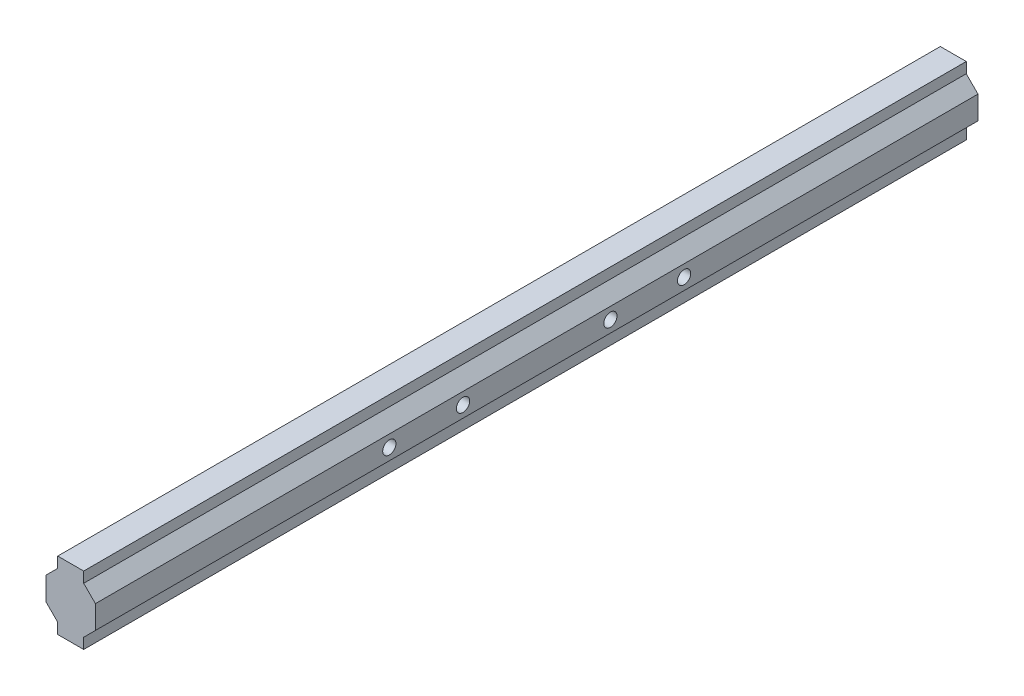
ISO-10303-21;
HEADER;
FILE_DESCRIPTION(('STEP AP214'),'2;1');
FILE_NAME('part.step','',(''),(''),'','','');
FILE_SCHEMA(('AUTOMOTIVE_DESIGN { 1 0 10303 214 1 1 1 1 }'));
ENDSEC;
DATA;
#1=APPLICATION_CONTEXT('core data for automotive mechanical design processes');
#2=APPLICATION_PROTOCOL_DEFINITION('international standard','automotive_design',2000,#1);
#3=PRODUCT_CONTEXT('',#1,'mechanical');
#4=PRODUCT('Part','Part','',(#3));
#5=PRODUCT_RELATED_PRODUCT_CATEGORY('part','',(#4));
#6=PRODUCT_DEFINITION_FORMATION('','',#4);
#7=PRODUCT_DEFINITION_CONTEXT('part definition',#1,'design');
#8=PRODUCT_DEFINITION('design','',#6,#7);
#9=PRODUCT_DEFINITION_SHAPE('','',#8);
#10=(LENGTH_UNIT() NAMED_UNIT(*) SI_UNIT(.MILLI.,.METRE.));
#11=(NAMED_UNIT(*) PLANE_ANGLE_UNIT() SI_UNIT($,.RADIAN.));
#12=(NAMED_UNIT(*) SI_UNIT($,.STERADIAN.) SOLID_ANGLE_UNIT());
#13=UNCERTAINTY_MEASURE_WITH_UNIT(LENGTH_MEASURE(1.E-05),#10,'distance_accuracy_value','');
#14=(GEOMETRIC_REPRESENTATION_CONTEXT(3) GLOBAL_UNCERTAINTY_ASSIGNED_CONTEXT((#13)) GLOBAL_UNIT_ASSIGNED_CONTEXT((#10,
#11,#12)) REPRESENTATION_CONTEXT('',''));
#15=CARTESIAN_POINT('',(0.,0.,0.));
#16=DIRECTION('',(0.,0.,1.));
#17=DIRECTION('',(1.,0.,0.));
#18=AXIS2_PLACEMENT_3D('',#15,#16,#17);
#19=CARTESIAN_POINT('',(-39.550290087148,0.0297695452971111,316.106580091162));
#20=DIRECTION('',(1.,0.,0.));
#21=DIRECTION('',(0.,0.,-1.));
#22=AXIS2_PLACEMENT_3D('',#19,#20,#21);
#23=PLANE('',#22);
#24=CARTESIAN_POINT('',(-39.550290087148,2.66200259233075,182.706580091162));
#25=DIRECTION('',(1.,0.,0.));
#26=DIRECTION('',(0.,0.,-1.));
#27=AXIS2_PLACEMENT_3D('',#24,#25,#26);
#28=CIRCLE('',#27,1.50000000000003);
#29=CARTESIAN_POINT('',(-39.550290087148,2.66200259233075,181.206580091161));
#30=VERTEX_POINT('',#29);
#31=EDGE_CURVE('E172',#30,#30,#28,.T.);
#32=ORIENTED_EDGE('',*,*,#31,.T.);
#33=EDGE_LOOP('',(#32));
#34=FACE_BOUND('',#33,.T.);
#35=CARTESIAN_POINT('',(-39.550290087148,2.66200259233075,199.406580091162));
#36=DIRECTION('',(1.,0.,0.));
#37=DIRECTION('',(0.,0.,-1.));
#38=AXIS2_PLACEMENT_3D('',#35,#36,#37);
#39=CIRCLE('',#38,1.50000000000003);
#40=CARTESIAN_POINT('',(-39.550290087148,2.66200259233075,197.906580091161));
#41=VERTEX_POINT('',#40);
#42=EDGE_CURVE('E280',#41,#41,#39,.T.);
#43=ORIENTED_EDGE('',*,*,#42,.T.);
#44=EDGE_LOOP('',(#43));
#45=FACE_BOUND('',#44,.T.);
#46=CARTESIAN_POINT('',(-39.550290087148,2.66200259233074,249.506580091162));
#47=DIRECTION('',(1.,0.,0.));
#48=DIRECTION('',(0.,0.,-1.));
#49=AXIS2_PLACEMENT_3D('',#46,#47,#48);
#50=CIRCLE('',#49,1.50000000000003);
#51=CARTESIAN_POINT('',(-39.550290087148,2.66200259233074,248.006580091161));
#52=VERTEX_POINT('',#51);
#53=EDGE_CURVE('E284',#52,#52,#50,.T.);
#54=ORIENTED_EDGE('',*,*,#53,.T.);
#55=EDGE_LOOP('',(#54));
#56=FACE_BOUND('',#55,.T.);
#57=CARTESIAN_POINT('',(-39.550290087148,2.66200259233074,232.806580091162));
#58=DIRECTION('',(1.,0.,0.));
#59=DIRECTION('',(0.,0.,-1.));
#60=AXIS2_PLACEMENT_3D('',#57,#58,#59);
#61=CIRCLE('',#60,1.50000000000003);
#62=CARTESIAN_POINT('',(-39.550290087148,2.66200259233074,231.306580091161));
#63=VERTEX_POINT('',#62);
#64=EDGE_CURVE('E287',#63,#63,#61,.T.);
#65=ORIENTED_EDGE('',*,*,#64,.T.);
#66=EDGE_LOOP('',(#65));
#67=FACE_BOUND('',#66,.T.);
#68=DIRECTION('',(0.,-1.,0.));
#69=VECTOR('',#68,1.);
#70=CARTESIAN_POINT('',(-39.550290087148,0.0297695452971111,116.106580091162));
#71=LINE('',#70,#69);
#72=CARTESIAN_POINT('',(-39.550290087148,5.29423563936438,116.106580091162));
#73=VERTEX_POINT('',#72);
#74=CARTESIAN_POINT('',(-39.550290087148,0.0297695452971111,116.106580091162));
#75=VERTEX_POINT('',#74);
#76=EDGE_CURVE('E168',#73,#75,#71,.T.);
#77=ORIENTED_EDGE('',*,*,#76,.T.);
#78=DIRECTION('',(0.,0.,-1.));
#79=VECTOR('',#78,1.);
#80=CARTESIAN_POINT('',(-39.550290087148,0.0297695452971111,316.106580091162));
#81=LINE('',#80,#79);
#82=CARTESIAN_POINT('',(-39.550290087148,0.0297695452971111,316.106580091162));
#83=VERTEX_POINT('',#82);
#84=EDGE_CURVE('E13',#83,#75,#81,.T.);
#85=ORIENTED_EDGE('',*,*,#84,.F.);
#86=DIRECTION('',(0.,-1.,0.));
#87=VECTOR('',#86,1.);
#88=CARTESIAN_POINT('',(-39.550290087148,0.0297695452971111,316.106580091162));
#89=LINE('',#88,#87);
#90=CARTESIAN_POINT('',(-39.550290087148,5.29423563936438,316.106580091162));
#91=VERTEX_POINT('',#90);
#92=EDGE_CURVE('E191',#91,#83,#89,.T.);
#93=ORIENTED_EDGE('',*,*,#92,.F.);
#94=DIRECTION('',(0.,0.,-1.));
#95=VECTOR('',#94,1.);
#96=CARTESIAN_POINT('',(-39.550290087148,5.29423563936438,316.106580091162));
#97=LINE('',#96,#95);
#98=EDGE_CURVE('E164',#91,#73,#97,.T.);
#99=ORIENTED_EDGE('',*,*,#98,.T.);
#100=EDGE_LOOP('',(#77,#85,#93,#99));
#101=FACE_BOUND('',#100,.T.);
#102=ADVANCED_FACE('F48',(#34,#45,#56,#67,#101),#23,.F.);
#103=CARTESIAN_POINT('',(-36.8896299153682,-2.63089062648271,316.106580091162));
#104=DIRECTION('',(0.707106781186547,0.707106781186547,0.));
#105=DIRECTION('',(-0.707106781186548,0.707106781186548,0.));
#106=AXIS2_PLACEMENT_3D('',#103,#104,#105);
#107=PLANE('',#106);
#108=DIRECTION('',(0.707106781186547,-0.707106781186547,0.));
#109=VECTOR('',#108,1.);
#110=CARTESIAN_POINT('',(-36.8896299153682,-2.63089062648271,116.106580091162));
#111=LINE('',#110,#109);
#112=CARTESIAN_POINT('',(-36.8896299153682,-2.63089062648271,116.106580091162));
#113=VERTEX_POINT('',#112);
#114=EDGE_CURVE('E171',#75,#113,#111,.T.);
#115=ORIENTED_EDGE('',*,*,#114,.T.);
#116=DIRECTION('',(0.,0.,-1.));
#117=VECTOR('',#116,1.);
#118=CARTESIAN_POINT('',(-36.8896299153682,-2.63089062648271,316.106580091162));
#119=LINE('',#118,#117);
#120=CARTESIAN_POINT('',(-36.8896299153682,-2.63089062648271,316.106580091162));
#121=VERTEX_POINT('',#120);
#122=EDGE_CURVE('E56',#121,#113,#119,.T.);
#123=ORIENTED_EDGE('',*,*,#122,.F.);
#124=DIRECTION('',(0.707106781186547,-0.707106781186547,0.));
#125=VECTOR('',#124,1.);
#126=CARTESIAN_POINT('',(-36.8896299153682,-2.63089062648271,316.106580091162));
#127=LINE('',#126,#125);
#128=EDGE_CURVE('E119',#83,#121,#127,.T.);
#129=ORIENTED_EDGE('',*,*,#128,.F.);
#130=ORIENTED_EDGE('',*,*,#84,.T.);
#131=EDGE_LOOP('',(#115,#123,#129,#130));
#132=FACE_BOUND('',#131,.T.);
#133=ADVANCED_FACE('F269',(#132),#107,.F.);
#134=CARTESIAN_POINT('',(-36.8896299153682,-5.03799740766926,316.106580091162));
#135=DIRECTION('',(1.,0.,0.));
#136=DIRECTION('',(0.,0.,-1.));
#137=AXIS2_PLACEMENT_3D('',#134,#135,#136);
#138=PLANE('',#137);
#139=DIRECTION('',(0.,-1.,0.));
#140=VECTOR('',#139,1.);
#141=CARTESIAN_POINT('',(-36.8896299153682,-5.03799740766926,116.106580091162));
#142=LINE('',#141,#140);
#143=CARTESIAN_POINT('',(-36.8896299153682,-5.03799740766926,116.106580091162));
#144=VERTEX_POINT('',#143);
#145=EDGE_CURVE('E174',#113,#144,#142,.T.);
#146=ORIENTED_EDGE('',*,*,#145,.T.);
#147=DIRECTION('',(0.,0.,-1.));
#148=VECTOR('',#147,1.);
#149=CARTESIAN_POINT('',(-36.8896299153682,-5.03799740766926,316.106580091162));
#150=LINE('',#149,#148);
#151=CARTESIAN_POINT('',(-36.8896299153682,-5.03799740766926,316.106580091162));
#152=VERTEX_POINT('',#151);
#153=EDGE_CURVE('E210',#152,#144,#150,.T.);
#154=ORIENTED_EDGE('',*,*,#153,.F.);
#155=DIRECTION('',(0.,-1.,0.));
#156=VECTOR('',#155,1.);
#157=CARTESIAN_POINT('',(-36.8896299153682,-5.03799740766926,316.106580091162));
#158=LINE('',#157,#156);
#159=EDGE_CURVE('E218',#121,#152,#158,.T.);
#160=ORIENTED_EDGE('',*,*,#159,.F.);
#161=ORIENTED_EDGE('',*,*,#122,.T.);
#162=EDGE_LOOP('',(#146,#154,#160,#161));
#163=FACE_BOUND('',#162,.T.);
#164=ADVANCED_FACE('F216',(#163),#138,.F.);
#165=CARTESIAN_POINT('',(-31.0109502589278,-5.03799740766925,316.106580091162));
#166=DIRECTION('',(0.,1.,0.));
#167=DIRECTION('',(-1.,0.,0.));
#168=AXIS2_PLACEMENT_3D('',#165,#166,#167);
#169=PLANE('',#168);
#170=DIRECTION('',(1.,0.,0.));
#171=VECTOR('',#170,1.);
#172=CARTESIAN_POINT('',(-31.0109502589278,-5.03799740766925,116.106580091162));
#173=LINE('',#172,#171);
#174=CARTESIAN_POINT('',(-31.0109502589278,-5.03799740766925,116.106580091162));
#175=VERTEX_POINT('',#174);
#176=EDGE_CURVE('E176',#144,#175,#173,.T.);
#177=ORIENTED_EDGE('',*,*,#176,.T.);
#178=DIRECTION('',(0.,0.,-1.));
#179=VECTOR('',#178,1.);
#180=CARTESIAN_POINT('',(-31.0109502589278,-5.03799740766925,316.106580091162));
#181=LINE('',#180,#179);
#182=CARTESIAN_POINT('',(-31.0109502589278,-5.03799740766925,316.106580091162));
#183=VERTEX_POINT('',#182);
#184=EDGE_CURVE('E207',#183,#175,#181,.T.);
#185=ORIENTED_EDGE('',*,*,#184,.F.);
#186=DIRECTION('',(1.,0.,0.));
#187=VECTOR('',#186,1.);
#188=CARTESIAN_POINT('',(-31.0109502589278,-5.03799740766925,316.106580091162));
#189=LINE('',#188,#187);
#190=EDGE_CURVE('E236',#152,#183,#189,.T.);
#191=ORIENTED_EDGE('',*,*,#190,.F.);
#192=ORIENTED_EDGE('',*,*,#153,.T.);
#193=EDGE_LOOP('',(#177,#185,#191,#192));
#194=FACE_BOUND('',#193,.T.);
#195=ADVANCED_FACE('F227',(#194),#169,.F.);
#196=CARTESIAN_POINT('',(-31.0109502589278,-2.63089062648273,316.106580091162));
#197=DIRECTION('',(-1.,0.,0.));
#198=DIRECTION('',(0.,0.,1.));
#199=AXIS2_PLACEMENT_3D('',#196,#197,#198);
#200=PLANE('',#199);
#201=DIRECTION('',(0.,1.,0.));
#202=VECTOR('',#201,1.);
#203=CARTESIAN_POINT('',(-31.0109502589278,-2.63089062648273,116.106580091162));
#204=LINE('',#203,#202);
#205=CARTESIAN_POINT('',(-31.0109502589278,-2.63089062648273,116.106580091162));
#206=VERTEX_POINT('',#205);
#207=EDGE_CURVE('E178',#175,#206,#204,.T.);
#208=ORIENTED_EDGE('',*,*,#207,.T.);
#209=DIRECTION('',(0.,0.,-1.));
#210=VECTOR('',#209,1.);
#211=CARTESIAN_POINT('',(-31.0109502589278,-2.63089062648273,316.106580091162));
#212=LINE('',#211,#210);
#213=CARTESIAN_POINT('',(-31.0109502589278,-2.63089062648273,316.106580091162));
#214=VERTEX_POINT('',#213);
#215=EDGE_CURVE('E204',#214,#206,#212,.T.);
#216=ORIENTED_EDGE('',*,*,#215,.F.);
#217=DIRECTION('',(0.,1.,0.));
#218=VECTOR('',#217,1.);
#219=CARTESIAN_POINT('',(-31.0109502589278,-2.63089062648273,316.106580091162));
#220=LINE('',#219,#218);
#221=EDGE_CURVE('E233',#183,#214,#220,.T.);
#222=ORIENTED_EDGE('',*,*,#221,.F.);
#223=ORIENTED_EDGE('',*,*,#184,.T.);
#224=EDGE_LOOP('',(#208,#216,#222,#223));
#225=FACE_BOUND('',#224,.T.);
#226=ADVANCED_FACE('F231',(#225),#200,.F.);
#227=CARTESIAN_POINT('',(-28.350290087148,0.0297695452971137,316.106580091162));
#228=DIRECTION('',(-0.707106781186548,0.707106781186548,0.));
#229=DIRECTION('',(-0.707106781186548,-0.707106781186548,0.));
#230=AXIS2_PLACEMENT_3D('',#227,#228,#229);
#231=PLANE('',#230);
#232=DIRECTION('',(0.707106781186548,0.707106781186548,0.));
#233=VECTOR('',#232,1.);
#234=CARTESIAN_POINT('',(-28.350290087148,0.0297695452971137,116.106580091162));
#235=LINE('',#234,#233);
#236=CARTESIAN_POINT('',(-28.350290087148,0.0297695452971137,116.106580091162));
#237=VERTEX_POINT('',#236);
#238=EDGE_CURVE('E180',#206,#237,#235,.T.);
#239=ORIENTED_EDGE('',*,*,#238,.T.);
#240=DIRECTION('',(0.,0.,-1.));
#241=VECTOR('',#240,1.);
#242=CARTESIAN_POINT('',(-28.350290087148,0.0297695452971137,316.106580091162));
#243=LINE('',#242,#241);
#244=CARTESIAN_POINT('',(-28.350290087148,0.0297695452971137,316.106580091162));
#245=VERTEX_POINT('',#244);
#246=EDGE_CURVE('E201',#245,#237,#243,.T.);
#247=ORIENTED_EDGE('',*,*,#246,.F.);
#248=DIRECTION('',(0.707106781186548,0.707106781186548,0.));
#249=VECTOR('',#248,1.);
#250=CARTESIAN_POINT('',(-28.350290087148,0.0297695452971137,316.106580091162));
#251=LINE('',#250,#249);
#252=EDGE_CURVE('E235',#214,#245,#251,.T.);
#253=ORIENTED_EDGE('',*,*,#252,.F.);
#254=ORIENTED_EDGE('',*,*,#215,.T.);
#255=EDGE_LOOP('',(#239,#247,#253,#254));
#256=FACE_BOUND('',#255,.T.);
#257=ADVANCED_FACE('F315',(#256),#231,.F.);
#258=CARTESIAN_POINT('',(-28.350290087148,5.29423563936437,316.106580091162));
#259=DIRECTION('',(-1.,0.,0.));
#260=DIRECTION('',(0.,0.,1.));
#261=AXIS2_PLACEMENT_3D('',#258,#259,#260);
#262=PLANE('',#261);
#263=CARTESIAN_POINT('',(-28.350290087148,2.66200259233075,182.706580091162));
#264=DIRECTION('',(1.,0.,0.));
#265=DIRECTION('',(0.,0.,1.));
#266=AXIS2_PLACEMENT_3D('',#263,#264,#265);
#267=CIRCLE('',#266,1.50000000000003);
#268=CARTESIAN_POINT('',(-28.350290087148,2.66200259233075,184.206580091162));
#269=VERTEX_POINT('',#268);
#270=EDGE_CURVE('E300',#269,#269,#267,.T.);
#271=ORIENTED_EDGE('',*,*,#270,.F.);
#272=EDGE_LOOP('',(#271));
#273=FACE_BOUND('',#272,.T.);
#274=CARTESIAN_POINT('',(-28.350290087148,2.66200259233075,199.406580091162));
#275=DIRECTION('',(1.,0.,0.));
#276=DIRECTION('',(0.,0.,1.));
#277=AXIS2_PLACEMENT_3D('',#274,#275,#276);
#278=CIRCLE('',#277,1.50000000000003);
#279=CARTESIAN_POINT('',(-28.350290087148,2.66200259233075,200.906580091162));
#280=VERTEX_POINT('',#279);
#281=EDGE_CURVE('E303',#280,#280,#278,.T.);
#282=ORIENTED_EDGE('',*,*,#281,.F.);
#283=EDGE_LOOP('',(#282));
#284=FACE_BOUND('',#283,.T.);
#285=CARTESIAN_POINT('',(-28.350290087148,2.66200259233074,249.506580091162));
#286=DIRECTION('',(1.,0.,0.));
#287=DIRECTION('',(0.,0.,-1.));
#288=AXIS2_PLACEMENT_3D('',#285,#286,#287);
#289=CIRCLE('',#288,1.50000000000003);
#290=CARTESIAN_POINT('',(-28.350290087148,2.66200259233074,248.006580091161));
#291=VERTEX_POINT('',#290);
#292=EDGE_CURVE('E293',#291,#291,#289,.T.);
#293=ORIENTED_EDGE('',*,*,#292,.F.);
#294=EDGE_LOOP('',(#293));
#295=FACE_BOUND('',#294,.T.);
#296=CARTESIAN_POINT('',(-28.350290087148,2.66200259233074,232.806580091162));
#297=DIRECTION('',(1.,0.,0.));
#298=DIRECTION('',(0.,0.,-1.));
#299=AXIS2_PLACEMENT_3D('',#296,#297,#298);
#300=CIRCLE('',#299,1.50000000000003);
#301=CARTESIAN_POINT('',(-28.350290087148,2.66200259233074,231.306580091161));
#302=VERTEX_POINT('',#301);
#303=EDGE_CURVE('E289',#302,#302,#300,.T.);
#304=ORIENTED_EDGE('',*,*,#303,.F.);
#305=EDGE_LOOP('',(#304));
#306=FACE_BOUND('',#305,.T.);
#307=DIRECTION('',(0.,1.,0.));
#308=VECTOR('',#307,1.);
#309=CARTESIAN_POINT('',(-28.350290087148,5.29423563936437,116.106580091162));
#310=LINE('',#309,#308);
#311=CARTESIAN_POINT('',(-28.350290087148,5.29423563936437,116.106580091162));
#312=VERTEX_POINT('',#311);
#313=EDGE_CURVE('E182',#237,#312,#310,.T.);
#314=ORIENTED_EDGE('',*,*,#313,.T.);
#315=DIRECTION('',(0.,0.,-1.));
#316=VECTOR('',#315,1.);
#317=CARTESIAN_POINT('',(-28.350290087148,5.29423563936437,316.106580091162));
#318=LINE('',#317,#316);
#319=CARTESIAN_POINT('',(-28.350290087148,5.29423563936437,316.106580091162));
#320=VERTEX_POINT('',#319);
#321=EDGE_CURVE('E198',#320,#312,#318,.T.);
#322=ORIENTED_EDGE('',*,*,#321,.F.);
#323=DIRECTION('',(0.,1.,0.));
#324=VECTOR('',#323,1.);
#325=CARTESIAN_POINT('',(-28.350290087148,5.29423563936437,316.106580091162));
#326=LINE('',#325,#324);
#327=EDGE_CURVE('E238',#245,#320,#326,.T.);
#328=ORIENTED_EDGE('',*,*,#327,.F.);
#329=ORIENTED_EDGE('',*,*,#246,.T.);
#330=EDGE_LOOP('',(#314,#322,#328,#329));
#331=FACE_BOUND('',#330,.T.);
#332=ADVANCED_FACE('F312',(#273,#284,#295,#306,#331),#262,.F.);
#333=CARTESIAN_POINT('',(-31.0109502589278,7.95489581114419,316.106580091162));
#334=DIRECTION('',(-0.707106781186547,-0.707106781186547,0.));
#335=DIRECTION('',(0.707106781186548,-0.707106781186548,0.));
#336=AXIS2_PLACEMENT_3D('',#333,#334,#335);
#337=PLANE('',#336);
#338=DIRECTION('',(-0.707106781186547,0.707106781186547,0.));
#339=VECTOR('',#338,1.);
#340=CARTESIAN_POINT('',(-31.0109502589278,7.95489581114419,116.106580091162));
#341=LINE('',#340,#339);
#342=CARTESIAN_POINT('',(-31.0109502589278,7.95489581114419,116.106580091162));
#343=VERTEX_POINT('',#342);
#344=EDGE_CURVE('E184',#312,#343,#341,.T.);
#345=ORIENTED_EDGE('',*,*,#344,.T.);
#346=DIRECTION('',(0.,0.,-1.));
#347=VECTOR('',#346,1.);
#348=CARTESIAN_POINT('',(-31.0109502589278,7.95489581114419,316.106580091162));
#349=LINE('',#348,#347);
#350=CARTESIAN_POINT('',(-31.0109502589278,7.95489581114419,316.106580091162));
#351=VERTEX_POINT('',#350);
#352=EDGE_CURVE('E195',#351,#343,#349,.T.);
#353=ORIENTED_EDGE('',*,*,#352,.F.);
#354=DIRECTION('',(-0.707106781186547,0.707106781186547,0.));
#355=VECTOR('',#354,1.);
#356=CARTESIAN_POINT('',(-31.0109502589278,7.95489581114419,316.106580091162));
#357=LINE('',#356,#355);
#358=EDGE_CURVE('E244',#320,#351,#357,.T.);
#359=ORIENTED_EDGE('',*,*,#358,.F.);
#360=ORIENTED_EDGE('',*,*,#321,.T.);
#361=EDGE_LOOP('',(#345,#353,#359,#360));
#362=FACE_BOUND('',#361,.T.);
#363=ADVANCED_FACE('F250',(#362),#337,.F.);
#364=CARTESIAN_POINT('',(-31.0109502589278,10.3620025923307,316.106580091162));
#365=DIRECTION('',(-1.,0.,0.));
#366=DIRECTION('',(0.,0.,1.));
#367=AXIS2_PLACEMENT_3D('',#364,#365,#366);
#368=PLANE('',#367);
#369=DIRECTION('',(0.,1.,0.));
#370=VECTOR('',#369,1.);
#371=CARTESIAN_POINT('',(-31.0109502589278,10.3620025923307,116.106580091162));
#372=LINE('',#371,#370);
#373=CARTESIAN_POINT('',(-31.0109502589278,10.3620025923307,116.106580091162));
#374=VERTEX_POINT('',#373);
#375=EDGE_CURVE('E186',#343,#374,#372,.T.);
#376=ORIENTED_EDGE('',*,*,#375,.T.);
#377=DIRECTION('',(0.,0.,-1.));
#378=VECTOR('',#377,1.);
#379=CARTESIAN_POINT('',(-31.0109502589278,10.3620025923307,316.106580091162));
#380=LINE('',#379,#378);
#381=CARTESIAN_POINT('',(-31.0109502589278,10.3620025923307,316.106580091162));
#382=VERTEX_POINT('',#381);
#383=EDGE_CURVE('E159',#382,#374,#380,.T.);
#384=ORIENTED_EDGE('',*,*,#383,.F.);
#385=DIRECTION('',(0.,1.,0.));
#386=VECTOR('',#385,1.);
#387=CARTESIAN_POINT('',(-31.0109502589278,10.3620025923307,316.106580091162));
#388=LINE('',#387,#386);
#389=EDGE_CURVE('E150',#351,#382,#388,.T.);
#390=ORIENTED_EDGE('',*,*,#389,.F.);
#391=ORIENTED_EDGE('',*,*,#352,.T.);
#392=EDGE_LOOP('',(#376,#384,#390,#391));
#393=FACE_BOUND('',#392,.T.);
#394=ADVANCED_FACE('F254',(#393),#368,.F.);
#395=CARTESIAN_POINT('',(-36.8896299153682,10.3620025923307,316.106580091162));
#396=DIRECTION('',(0.,-1.,0.));
#397=DIRECTION('',(0.,0.,-1.));
#398=AXIS2_PLACEMENT_3D('',#395,#396,#397);
#399=PLANE('',#398);
#400=DIRECTION('',(-1.,0.,0.));
#401=VECTOR('',#400,1.);
#402=CARTESIAN_POINT('',(-36.8896299153682,10.3620025923307,116.106580091162));
#403=LINE('',#402,#401);
#404=CARTESIAN_POINT('',(-36.8896299153682,10.3620025923307,116.106580091162));
#405=VERTEX_POINT('',#404);
#406=EDGE_CURVE('E158',#374,#405,#403,.T.);
#407=ORIENTED_EDGE('',*,*,#406,.T.);
#408=DIRECTION('',(0.,0.,-1.));
#409=VECTOR('',#408,1.);
#410=CARTESIAN_POINT('',(-36.8896299153682,10.3620025923307,316.106580091162));
#411=LINE('',#410,#409);
#412=CARTESIAN_POINT('',(-36.8896299153682,10.3620025923307,316.106580091162));
#413=VERTEX_POINT('',#412);
#414=EDGE_CURVE('E155',#413,#405,#411,.T.);
#415=ORIENTED_EDGE('',*,*,#414,.F.);
#416=DIRECTION('',(-1.,0.,0.));
#417=VECTOR('',#416,1.);
#418=CARTESIAN_POINT('',(-36.8896299153682,10.3620025923307,316.106580091162));
#419=LINE('',#418,#417);
#420=EDGE_CURVE('E144',#382,#413,#419,.T.);
#421=ORIENTED_EDGE('',*,*,#420,.F.);
#422=ORIENTED_EDGE('',*,*,#383,.T.);
#423=EDGE_LOOP('',(#407,#415,#421,#422));
#424=FACE_BOUND('',#423,.T.);
#425=ADVANCED_FACE('F156',(#424),#399,.F.);
#426=CARTESIAN_POINT('',(-36.8896299153682,7.9548958111442,316.106580091162));
#427=DIRECTION('',(1.,0.,0.));
#428=DIRECTION('',(0.,0.,-1.));
#429=AXIS2_PLACEMENT_3D('',#426,#427,#428);
#430=PLANE('',#429);
#431=DIRECTION('',(0.,-1.,0.));
#432=VECTOR('',#431,1.);
#433=CARTESIAN_POINT('',(-36.8896299153682,7.9548958111442,116.106580091162));
#434=LINE('',#433,#432);
#435=CARTESIAN_POINT('',(-36.8896299153682,7.9548958111442,116.106580091162));
#436=VERTEX_POINT('',#435);
#437=EDGE_CURVE('E105',#405,#436,#434,.T.);
#438=ORIENTED_EDGE('',*,*,#437,.T.);
#439=DIRECTION('',(0.,0.,-1.));
#440=VECTOR('',#439,1.);
#441=CARTESIAN_POINT('',(-36.8896299153682,7.9548958111442,316.106580091162));
#442=LINE('',#441,#440);
#443=CARTESIAN_POINT('',(-36.8896299153682,7.9548958111442,316.106580091162));
#444=VERTEX_POINT('',#443);
#445=EDGE_CURVE('E160',#444,#436,#442,.T.);
#446=ORIENTED_EDGE('',*,*,#445,.F.);
#447=DIRECTION('',(0.,-1.,0.));
#448=VECTOR('',#447,1.);
#449=CARTESIAN_POINT('',(-36.8896299153682,7.9548958111442,316.106580091162));
#450=LINE('',#449,#448);
#451=EDGE_CURVE('E148',#413,#444,#450,.T.);
#452=ORIENTED_EDGE('',*,*,#451,.F.);
#453=ORIENTED_EDGE('',*,*,#414,.T.);
#454=EDGE_LOOP('',(#438,#446,#452,#453));
#455=FACE_BOUND('',#454,.T.);
#456=ADVANCED_FACE('F162',(#455),#430,.F.);
#457=CARTESIAN_POINT('',(-39.550290087148,5.29423563936438,316.106580091162));
#458=DIRECTION('',(0.707106781186547,-0.707106781186547,0.));
#459=DIRECTION('',(0.707106781186548,0.707106781186548,0.));
#460=AXIS2_PLACEMENT_3D('',#457,#458,#459);
#461=PLANE('',#460);
#462=DIRECTION('',(-0.707106781186547,-0.707106781186547,0.));
#463=VECTOR('',#462,1.);
#464=CARTESIAN_POINT('',(-39.550290087148,5.29423563936438,116.106580091162));
#465=LINE('',#464,#463);
#466=EDGE_CURVE('E111',#436,#73,#465,.T.);
#467=ORIENTED_EDGE('',*,*,#466,.T.);
#468=ORIENTED_EDGE('',*,*,#98,.F.);
#469=DIRECTION('',(-0.707106781186547,-0.707106781186547,0.));
#470=VECTOR('',#469,1.);
#471=CARTESIAN_POINT('',(-39.550290087148,5.29423563936438,316.106580091162));
#472=LINE('',#471,#470);
#473=EDGE_CURVE('E64',#444,#91,#472,.T.);
#474=ORIENTED_EDGE('',*,*,#473,.F.);
#475=ORIENTED_EDGE('',*,*,#445,.T.);
#476=EDGE_LOOP('',(#467,#468,#474,#475));
#477=FACE_BOUND('',#476,.T.);
#478=ADVANCED_FACE('F258',(#477),#461,.F.);
#479=CARTESIAN_POINT('',(0.,0.,316.106580091162));
#480=DIRECTION('',(0.,0.,-1.));
#481=DIRECTION('',(-1.,0.,0.));
#482=AXIS2_PLACEMENT_3D('',#479,#480,#481);
#483=PLANE('',#482);
#484=ORIENTED_EDGE('',*,*,#92,.T.);
#485=ORIENTED_EDGE('',*,*,#128,.T.);
#486=ORIENTED_EDGE('',*,*,#159,.T.);
#487=ORIENTED_EDGE('',*,*,#190,.T.);
#488=ORIENTED_EDGE('',*,*,#221,.T.);
#489=ORIENTED_EDGE('',*,*,#252,.T.);
#490=ORIENTED_EDGE('',*,*,#327,.T.);
#491=ORIENTED_EDGE('',*,*,#358,.T.);
#492=ORIENTED_EDGE('',*,*,#389,.T.);
#493=ORIENTED_EDGE('',*,*,#420,.T.);
#494=ORIENTED_EDGE('',*,*,#451,.T.);
#495=ORIENTED_EDGE('',*,*,#473,.T.);
#496=EDGE_LOOP('',(#484,#485,#486,#487,#488,#489,#490,#491,#492,#493,#494,#495));
#497=FACE_BOUND('',#496,.T.);
#498=ADVANCED_FACE('F146',(#497),#483,.F.);
#499=CARTESIAN_POINT('',(0.,0.,116.106580091162));
#500=DIRECTION('',(0.,0.,-1.));
#501=DIRECTION('',(-1.,0.,0.));
#502=AXIS2_PLACEMENT_3D('',#499,#500,#501);
#503=PLANE('',#502);
#504=ORIENTED_EDGE('',*,*,#76,.F.);
#505=ORIENTED_EDGE('',*,*,#466,.F.);
#506=ORIENTED_EDGE('',*,*,#437,.F.);
#507=ORIENTED_EDGE('',*,*,#406,.F.);
#508=ORIENTED_EDGE('',*,*,#375,.F.);
#509=ORIENTED_EDGE('',*,*,#344,.F.);
#510=ORIENTED_EDGE('',*,*,#313,.F.);
#511=ORIENTED_EDGE('',*,*,#238,.F.);
#512=ORIENTED_EDGE('',*,*,#207,.F.);
#513=ORIENTED_EDGE('',*,*,#176,.F.);
#514=ORIENTED_EDGE('',*,*,#145,.F.);
#515=ORIENTED_EDGE('',*,*,#114,.F.);
#516=EDGE_LOOP('',(#504,#505,#506,#507,#508,#509,#510,#511,#512,#513,#514,#515));
#517=FACE_BOUND('',#516,.T.);
#518=ADVANCED_FACE('F222',(#517),#503,.T.);
#519=CARTESIAN_POINT('',(-48.350290087148,2.66200259233074,232.806580091162));
#520=DIRECTION('',(1.,0.,0.));
#521=DIRECTION('',(0.,0.,-1.));
#522=AXIS2_PLACEMENT_3D('',#519,#520,#521);
#523=CYLINDRICAL_SURFACE('',#522,1.50000000000003);
#524=ORIENTED_EDGE('',*,*,#303,.T.);
#525=EDGE_LOOP('',(#524));
#526=FACE_BOUND('',#525,.T.);
#527=ORIENTED_EDGE('',*,*,#64,.F.);
#528=EDGE_LOOP('',(#527));
#529=FACE_BOUND('',#528,.T.);
#530=ADVANCED_FACE('F398',(#526,#529),#523,.F.);
#531=CARTESIAN_POINT('',(-48.350290087148,2.66200259233074,249.506580091162));
#532=DIRECTION('',(1.,0.,0.));
#533=DIRECTION('',(0.,0.,-1.));
#534=AXIS2_PLACEMENT_3D('',#531,#532,#533);
#535=CYLINDRICAL_SURFACE('',#534,1.50000000000003);
#536=ORIENTED_EDGE('',*,*,#292,.T.);
#537=EDGE_LOOP('',(#536));
#538=FACE_BOUND('',#537,.T.);
#539=ORIENTED_EDGE('',*,*,#53,.F.);
#540=EDGE_LOOP('',(#539));
#541=FACE_BOUND('',#540,.T.);
#542=ADVANCED_FACE('F309',(#538,#541),#535,.F.);
#543=CARTESIAN_POINT('',(-48.350290087148,2.66200259233075,199.406580091162));
#544=DIRECTION('',(1.,0.,0.));
#545=DIRECTION('',(0.,0.,-1.));
#546=AXIS2_PLACEMENT_3D('',#543,#544,#545);
#547=CYLINDRICAL_SURFACE('',#546,1.50000000000003);
#548=ORIENTED_EDGE('',*,*,#281,.T.);
#549=EDGE_LOOP('',(#548));
#550=FACE_BOUND('',#549,.T.);
#551=ORIENTED_EDGE('',*,*,#42,.F.);
#552=EDGE_LOOP('',(#551));
#553=FACE_BOUND('',#552,.T.);
#554=ADVANCED_FACE('F426',(#550,#553),#547,.F.);
#555=CARTESIAN_POINT('',(-48.350290087148,2.66200259233075,182.706580091162));
#556=DIRECTION('',(1.,0.,0.));
#557=DIRECTION('',(0.,0.,-1.));
#558=AXIS2_PLACEMENT_3D('',#555,#556,#557);
#559=CYLINDRICAL_SURFACE('',#558,1.50000000000003);
#560=ORIENTED_EDGE('',*,*,#270,.T.);
#561=EDGE_LOOP('',(#560));
#562=FACE_BOUND('',#561,.T.);
#563=ORIENTED_EDGE('',*,*,#31,.F.);
#564=EDGE_LOOP('',(#563));
#565=FACE_BOUND('',#564,.T.);
#566=ADVANCED_FACE('F435',(#562,#565),#559,.F.);
#567=CLOSED_SHELL('',(#102,#133,#164,#195,#226,#257,#332,#363,#394,#425,#456,#478,#498,#518,
#530,#542,#554,#566));
#568=MANIFOLD_SOLID_BREP('B2',#567);
#569=ADVANCED_BREP_SHAPE_REPRESENTATION('',(#18,#568),#14);
#570=SHAPE_DEFINITION_REPRESENTATION(#9,#569);
ENDSEC;
END-ISO-10303-21;
